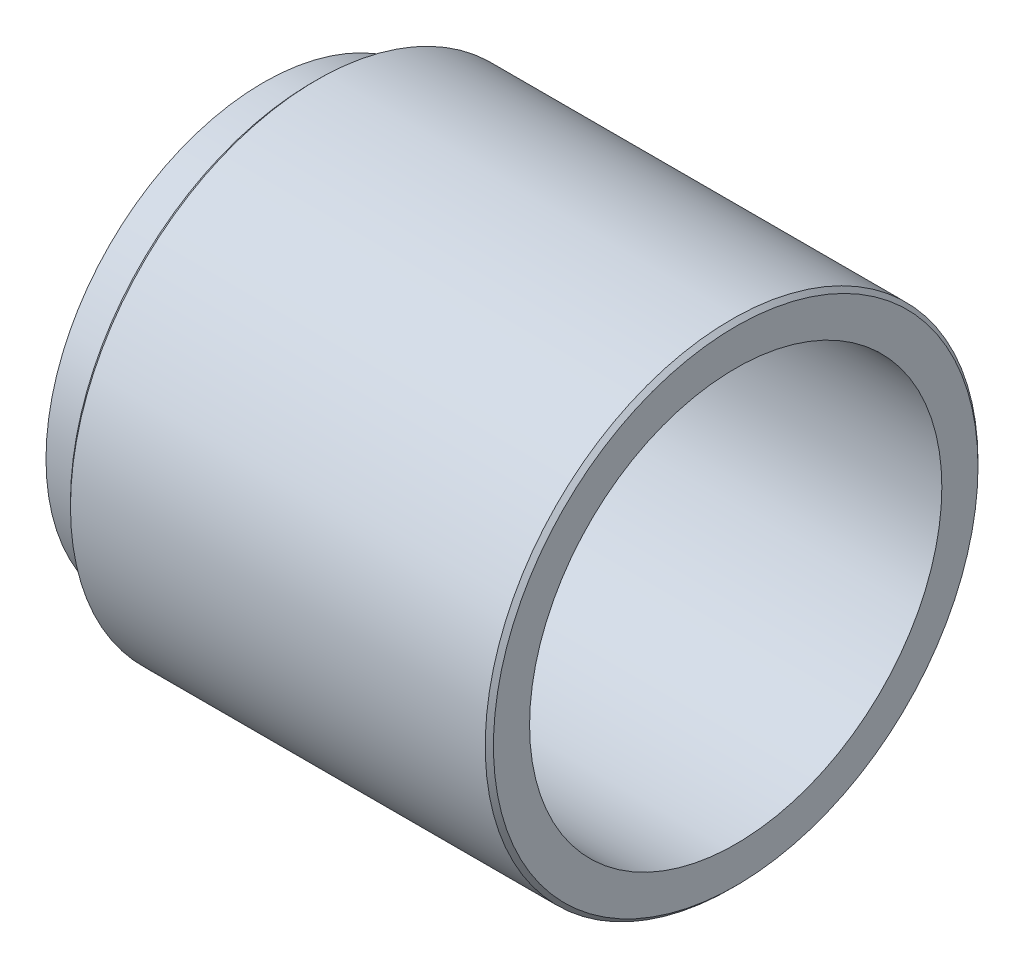
ISO-10303-21;
HEADER;
FILE_DESCRIPTION(('STEP AP214'),'2;1');
FILE_NAME('part.step','',(''),(''),'','','');
FILE_SCHEMA(('AUTOMOTIVE_DESIGN { 1 0 10303 214 1 1 1 1 }'));
ENDSEC;
DATA;
#1=APPLICATION_CONTEXT('core data for automotive mechanical design processes');
#2=APPLICATION_PROTOCOL_DEFINITION('international standard','automotive_design',2000,#1);
#3=PRODUCT_CONTEXT('',#1,'mechanical');
#4=PRODUCT('Part','Part','',(#3));
#5=PRODUCT_RELATED_PRODUCT_CATEGORY('part','',(#4));
#6=PRODUCT_DEFINITION_FORMATION('','',#4);
#7=PRODUCT_DEFINITION_CONTEXT('part definition',#1,'design');
#8=PRODUCT_DEFINITION('design','',#6,#7);
#9=PRODUCT_DEFINITION_SHAPE('','',#8);
#10=(LENGTH_UNIT() NAMED_UNIT(*) SI_UNIT(.MILLI.,.METRE.));
#11=(NAMED_UNIT(*) PLANE_ANGLE_UNIT() SI_UNIT($,.RADIAN.));
#12=(NAMED_UNIT(*) SI_UNIT($,.STERADIAN.) SOLID_ANGLE_UNIT());
#13=UNCERTAINTY_MEASURE_WITH_UNIT(LENGTH_MEASURE(1.E-05),#10,'distance_accuracy_value','');
#14=(GEOMETRIC_REPRESENTATION_CONTEXT(3) GLOBAL_UNCERTAINTY_ASSIGNED_CONTEXT((#13)) GLOBAL_UNIT_ASSIGNED_CONTEXT((#10,
#11,#12)) REPRESENTATION_CONTEXT('',''));
#15=CARTESIAN_POINT('',(0.,0.,0.));
#16=DIRECTION('',(0.,0.,1.));
#17=DIRECTION('',(1.,0.,0.));
#18=AXIS2_PLACEMENT_3D('',#15,#16,#17);
#19=CARTESIAN_POINT('',(-25.4,12.0015,0.));
#20=DIRECTION('',(1.,0.,0.));
#21=DIRECTION('',(0.,0.,-1.));
#22=AXIS2_PLACEMENT_3D('',#19,#20,#21);
#23=PLANE('',#22);
#24=CARTESIAN_POINT('',(-25.4,0.,0.));
#25=DIRECTION('',(1.,0.,0.));
#26=DIRECTION('',(0.,0.,-1.));
#27=AXIS2_PLACEMENT_3D('',#24,#25,#26);
#28=CIRCLE('',#27,12.75);
#29=CARTESIAN_POINT('',(-25.4,0.,-12.75));
#30=VERTEX_POINT('',#29);
#31=EDGE_CURVE('E74',#30,#30,#28,.F.);
#32=ORIENTED_EDGE('',*,*,#31,.F.);
#33=EDGE_LOOP('',(#32));
#34=FACE_BOUND('',#33,.T.);
#35=CARTESIAN_POINT('',(-25.4,0.,0.));
#36=DIRECTION('',(1.,0.,0.));
#37=DIRECTION('',(0.,0.,-1.));
#38=AXIS2_PLACEMENT_3D('',#35,#36,#37);
#39=CIRCLE('',#38,11.5);
#40=CARTESIAN_POINT('',(-25.4,0.,-11.5));
#41=VERTEX_POINT('',#40);
#42=EDGE_CURVE('E80',#41,#41,#39,.T.);
#43=ORIENTED_EDGE('',*,*,#42,.F.);
#44=EDGE_LOOP('',(#43));
#45=FACE_BOUND('',#44,.T.);
#46=ADVANCED_FACE('F41',(#34,#45),#23,.T.);
#47=CARTESIAN_POINT('',(0.,15.24,0.));
#48=DIRECTION('',(1.,0.,0.));
#49=DIRECTION('',(0.,0.,-1.));
#50=AXIS2_PLACEMENT_3D('',#47,#48,#49);
#51=PLANE('',#50);
#52=CARTESIAN_POINT('',(0.,0.,0.));
#53=DIRECTION('',(1.,0.,0.));
#54=DIRECTION('',(0.,0.,-1.));
#55=AXIS2_PLACEMENT_3D('',#52,#53,#54);
#56=CIRCLE('',#55,14.986);
#57=CARTESIAN_POINT('',(0.,0.,-14.986));
#58=VERTEX_POINT('',#57);
#59=EDGE_CURVE('E48',#58,#58,#56,.T.);
#60=ORIENTED_EDGE('',*,*,#59,.T.);
#61=EDGE_LOOP('',(#60));
#62=FACE_BOUND('',#61,.T.);
#63=CARTESIAN_POINT('',(0.,0.,0.));
#64=DIRECTION('',(1.,0.,0.));
#65=DIRECTION('',(0.,0.,-1.));
#66=AXIS2_PLACEMENT_3D('',#63,#64,#65);
#67=CIRCLE('',#66,12.75);
#68=CARTESIAN_POINT('',(0.,0.,-12.75));
#69=VERTEX_POINT('',#68);
#70=EDGE_CURVE('E77',#69,#69,#67,.T.);
#71=ORIENTED_EDGE('',*,*,#70,.F.);
#72=EDGE_LOOP('',(#71));
#73=FACE_BOUND('',#72,.T.);
#74=ADVANCED_FACE('F87',(#62,#73),#51,.T.);
#75=CARTESIAN_POINT('',(0.,0.,0.));
#76=DIRECTION('',(1.,0.,0.));
#77=DIRECTION('',(0.,0.,-1.));
#78=AXIS2_PLACEMENT_3D('',#75,#76,#77);
#79=CYLINDRICAL_SURFACE('',#78,15.24);
#80=CARTESIAN_POINT('',(-25.908,0.,0.));
#81=DIRECTION('',(-1.,0.,0.));
#82=DIRECTION('',(0.,0.,1.));
#83=AXIS2_PLACEMENT_3D('',#80,#81,#82);
#84=CIRCLE('',#83,15.24);
#85=CARTESIAN_POINT('',(-25.908,0.,15.24));
#86=VERTEX_POINT('',#85);
#87=EDGE_CURVE('E59',#86,#86,#84,.F.);
#88=ORIENTED_EDGE('',*,*,#87,.T.);
#89=EDGE_LOOP('',(#88));
#90=FACE_BOUND('',#89,.T.);
#91=CARTESIAN_POINT('',(-0.254000000000004,0.,0.));
#92=DIRECTION('',(1.,0.,0.));
#93=DIRECTION('',(0.,0.,-1.));
#94=AXIS2_PLACEMENT_3D('',#91,#92,#93);
#95=CIRCLE('',#94,15.24);
#96=CARTESIAN_POINT('',(-0.254000000000004,0.,-15.24));
#97=VERTEX_POINT('',#96);
#98=EDGE_CURVE('E64',#97,#97,#95,.F.);
#99=ORIENTED_EDGE('',*,*,#98,.T.);
#100=EDGE_LOOP('',(#99));
#101=FACE_BOUND('',#100,.T.);
#102=ADVANCED_FACE('F94',(#90,#101),#79,.T.);
#103=CARTESIAN_POINT('',(-25.908,0.,0.));
#104=DIRECTION('',(1.,0.,0.));
#105=DIRECTION('',(0.,0.,-1.));
#106=AXIS2_PLACEMENT_3D('',#103,#104,#105);
#107=CONICAL_SURFACE('',#106,15.24,0.785398163397438);
#108=CARTESIAN_POINT('',(-26.162,0.,0.));
#109=DIRECTION('',(-1.,0.,0.));
#110=DIRECTION('',(0.,0.,1.));
#111=AXIS2_PLACEMENT_3D('',#108,#109,#110);
#112=CIRCLE('',#111,14.986);
#113=CARTESIAN_POINT('',(-26.162,0.,14.986));
#114=VERTEX_POINT('',#113);
#115=EDGE_CURVE('E53',#114,#114,#112,.T.);
#116=ORIENTED_EDGE('',*,*,#115,.F.);
#117=EDGE_LOOP('',(#116));
#118=FACE_BOUND('',#117,.T.);
#119=ORIENTED_EDGE('',*,*,#87,.F.);
#120=EDGE_LOOP('',(#119));
#121=FACE_BOUND('',#120,.T.);
#122=ADVANCED_FACE('F110',(#118,#121),#107,.T.);
#123=CARTESIAN_POINT('',(0.,0.,0.));
#124=DIRECTION('',(-1.,0.,0.));
#125=DIRECTION('',(0.,0.,1.));
#126=AXIS2_PLACEMENT_3D('',#123,#124,#125);
#127=CONICAL_SURFACE('',#126,14.986,0.785398163397448);
#128=ORIENTED_EDGE('',*,*,#98,.F.);
#129=EDGE_LOOP('',(#128));
#130=FACE_BOUND('',#129,.T.);
#131=ORIENTED_EDGE('',*,*,#59,.F.);
#132=EDGE_LOOP('',(#131));
#133=FACE_BOUND('',#132,.T.);
#134=ADVANCED_FACE('F43',(#130,#133),#127,.T.);
#135=CARTESIAN_POINT('',(-26.162,15.24,0.));
#136=DIRECTION('',(-1.,0.,0.));
#137=DIRECTION('',(0.,0.,1.));
#138=AXIS2_PLACEMENT_3D('',#135,#136,#137);
#139=PLANE('',#138);
#140=CARTESIAN_POINT('',(-26.162,0.,0.));
#141=DIRECTION('',(-1.,0.,0.));
#142=DIRECTION('',(0.,0.,1.));
#143=AXIS2_PLACEMENT_3D('',#140,#141,#142);
#144=CIRCLE('',#143,13.45);
#145=CARTESIAN_POINT('',(-26.162,0.,13.45));
#146=VERTEX_POINT('',#145);
#147=EDGE_CURVE('E10',#146,#146,#144,.T.);
#148=ORIENTED_EDGE('',*,*,#147,.F.);
#149=EDGE_LOOP('',(#148));
#150=FACE_BOUND('',#149,.T.);
#151=ORIENTED_EDGE('',*,*,#115,.T.);
#152=EDGE_LOOP('',(#151));
#153=FACE_BOUND('',#152,.T.);
#154=ADVANCED_FACE('F105',(#150,#153),#139,.T.);
#155=CARTESIAN_POINT('',(11.8803448278363,0.,0.));
#156=DIRECTION('',(-1.,0.,0.));
#157=DIRECTION('',(0.,0.,1.));
#158=AXIS2_PLACEMENT_3D('',#155,#156,#157);
#159=CYLINDRICAL_SURFACE('',#158,13.45);
#160=ORIENTED_EDGE('',*,*,#147,.T.);
#161=EDGE_LOOP('',(#160));
#162=FACE_BOUND('',#161,.T.);
#163=CARTESIAN_POINT('',(-29.21,0.,0.));
#164=DIRECTION('',(-1.,0.,0.));
#165=DIRECTION('',(0.,0.,1.));
#166=AXIS2_PLACEMENT_3D('',#163,#164,#165);
#167=CIRCLE('',#166,13.45);
#168=CARTESIAN_POINT('',(-29.21,0.,13.45));
#169=VERTEX_POINT('',#168);
#170=EDGE_CURVE('E68',#169,#169,#167,.T.);
#171=ORIENTED_EDGE('',*,*,#170,.F.);
#172=EDGE_LOOP('',(#171));
#173=FACE_BOUND('',#172,.T.);
#174=ADVANCED_FACE('F99',(#162,#173),#159,.T.);
#175=CARTESIAN_POINT('',(-29.21,13.1445,0.));
#176=DIRECTION('',(-1.,0.,0.));
#177=DIRECTION('',(0.,0.,1.));
#178=AXIS2_PLACEMENT_3D('',#175,#176,#177);
#179=PLANE('',#178);
#180=ORIENTED_EDGE('',*,*,#170,.T.);
#181=EDGE_LOOP('',(#180));
#182=FACE_BOUND('',#181,.T.);
#183=CARTESIAN_POINT('',(-29.21,0.,0.));
#184=DIRECTION('',(-1.,0.,0.));
#185=DIRECTION('',(0.,0.,1.));
#186=AXIS2_PLACEMENT_3D('',#183,#184,#185);
#187=CIRCLE('',#186,11.5);
#188=CARTESIAN_POINT('',(-29.21,0.,11.5));
#189=VERTEX_POINT('',#188);
#190=EDGE_CURVE('E71',#189,#189,#187,.T.);
#191=ORIENTED_EDGE('',*,*,#190,.F.);
#192=EDGE_LOOP('',(#191));
#193=FACE_BOUND('',#192,.T.);
#194=ADVANCED_FACE('F101',(#182,#193),#179,.T.);
#195=CARTESIAN_POINT('',(11.8803448278363,0.,0.));
#196=DIRECTION('',(-1.,0.,0.));
#197=DIRECTION('',(0.,0.,1.));
#198=AXIS2_PLACEMENT_3D('',#195,#196,#197);
#199=CYLINDRICAL_SURFACE('',#198,11.5);
#200=ORIENTED_EDGE('',*,*,#190,.T.);
#201=EDGE_LOOP('',(#200));
#202=FACE_BOUND('',#201,.T.);
#203=ORIENTED_EDGE('',*,*,#42,.T.);
#204=EDGE_LOOP('',(#203));
#205=FACE_BOUND('',#204,.T.);
#206=ADVANCED_FACE('F84',(#202,#205),#199,.F.);
#207=CARTESIAN_POINT('',(-67.7868088914464,0.,0.));
#208=DIRECTION('',(1.,0.,0.));
#209=DIRECTION('',(0.,0.,-1.));
#210=AXIS2_PLACEMENT_3D('',#207,#208,#209);
#211=CYLINDRICAL_SURFACE('',#210,12.75);
#212=ORIENTED_EDGE('',*,*,#31,.T.);
#213=EDGE_LOOP('',(#212));
#214=FACE_BOUND('',#213,.T.);
#215=ORIENTED_EDGE('',*,*,#70,.T.);
#216=EDGE_LOOP('',(#215));
#217=FACE_BOUND('',#216,.T.);
#218=ADVANCED_FACE('F167',(#214,#217),#211,.F.);
#219=CLOSED_SHELL('',(#46,#74,#102,#122,#134,#154,#174,#194,#206,#218));
#220=MANIFOLD_SOLID_BREP('B2',#219);
#221=ADVANCED_BREP_SHAPE_REPRESENTATION('',(#18,#220),#14);
#222=SHAPE_DEFINITION_REPRESENTATION(#9,#221);
ENDSEC;
END-ISO-10303-21;
